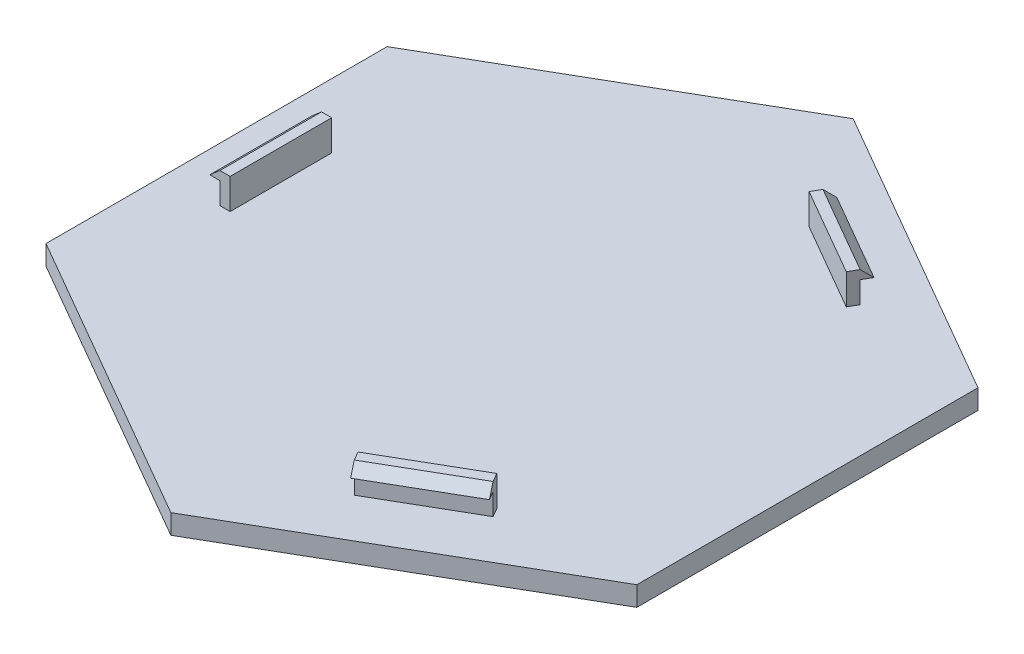
ISO-10303-21;
HEADER;
FILE_DESCRIPTION(('STEP AP214'),'2;1');
FILE_NAME('part.step','',(''),(''),'','','');
FILE_SCHEMA(('AUTOMOTIVE_DESIGN { 1 0 10303 214 1 1 1 1 }'));
ENDSEC;
DATA;
#1=APPLICATION_CONTEXT('core data for automotive mechanical design processes');
#2=APPLICATION_PROTOCOL_DEFINITION('international standard','automotive_design',2000,#1);
#3=PRODUCT_CONTEXT('',#1,'mechanical');
#4=PRODUCT('Part','Part','',(#3));
#5=PRODUCT_RELATED_PRODUCT_CATEGORY('part','',(#4));
#6=PRODUCT_DEFINITION_FORMATION('','',#4);
#7=PRODUCT_DEFINITION_CONTEXT('part definition',#1,'design');
#8=PRODUCT_DEFINITION('design','',#6,#7);
#9=PRODUCT_DEFINITION_SHAPE('','',#8);
#10=(LENGTH_UNIT() NAMED_UNIT(*) SI_UNIT(.MILLI.,.METRE.));
#11=(NAMED_UNIT(*) PLANE_ANGLE_UNIT() SI_UNIT($,.RADIAN.));
#12=(NAMED_UNIT(*) SI_UNIT($,.STERADIAN.) SOLID_ANGLE_UNIT());
#13=UNCERTAINTY_MEASURE_WITH_UNIT(LENGTH_MEASURE(1.E-05),#10,'distance_accuracy_value','');
#14=(GEOMETRIC_REPRESENTATION_CONTEXT(3) GLOBAL_UNCERTAINTY_ASSIGNED_CONTEXT((#13)) GLOBAL_UNIT_ASSIGNED_CONTEXT((#10,
#11,#12)) REPRESENTATION_CONTEXT('',''));
#15=CARTESIAN_POINT('',(0.,0.,0.));
#16=DIRECTION('',(0.,0.,1.));
#17=DIRECTION('',(1.,0.,0.));
#18=AXIS2_PLACEMENT_3D('',#15,#16,#17);
#19=CARTESIAN_POINT('',(24.3051905283835,7.4,-27.0978248828015));
#20=DIRECTION('',(-0.5,0.,0.866025403784439));
#21=DIRECTION('',(0.866025403784439,0.,0.5));
#22=AXIS2_PLACEMENT_3D('',#19,#20,#21);
#23=PLANE('',#22);
#24=DIRECTION('',(-0.866025403784439,0.,-0.5));
#25=VECTOR('',#24,1.);
#26=CARTESIAN_POINT('',(17.81,6.1,-30.8478248828017));
#27=LINE('',#26,#25);
#28=CARTESIAN_POINT('',(24.3051905283835,6.1,-27.0978248828015));
#29=VERTEX_POINT('',#28);
#30=CARTESIAN_POINT('',(11.3148094716169,6.1,-34.5978248828016));
#31=VERTEX_POINT('',#30);
#32=EDGE_CURVE('E456',#29,#31,#27,.T.);
#33=ORIENTED_EDGE('',*,*,#32,.F.);
#34=DIRECTION('',(0.,-1.,0.));
#35=VECTOR('',#34,1.);
#36=CARTESIAN_POINT('',(24.3051905283835,7.4,-27.0978248828015));
#37=LINE('',#36,#35);
#38=CARTESIAN_POINT('',(24.3051905283835,2.9,-27.0978248828015));
#39=VERTEX_POINT('',#38);
#40=EDGE_CURVE('E238',#29,#39,#37,.T.);
#41=ORIENTED_EDGE('',*,*,#40,.T.);
#42=DIRECTION('',(-0.866025403784439,0.,-0.5));
#43=VECTOR('',#42,1.);
#44=CARTESIAN_POINT('',(24.3051905283835,2.9,-27.0978248828015));
#45=LINE('',#44,#43);
#46=CARTESIAN_POINT('',(11.3148094716169,2.9,-34.5978248828015));
#47=VERTEX_POINT('',#46);
#48=EDGE_CURVE('E261',#39,#47,#45,.T.);
#49=ORIENTED_EDGE('',*,*,#48,.T.);
#50=DIRECTION('',(0.,-1.,0.));
#51=VECTOR('',#50,1.);
#52=CARTESIAN_POINT('',(11.3148094716169,7.4,-34.5978248828015));
#53=LINE('',#52,#51);
#54=EDGE_CURVE('E244',#31,#47,#53,.T.);
#55=ORIENTED_EDGE('',*,*,#54,.F.);
#56=EDGE_LOOP('',(#33,#41,#49,#55));
#57=FACE_BOUND('',#56,.T.);
#58=ADVANCED_FACE('F45',(#57),#23,.F.);
#59=CARTESIAN_POINT('',(11.3148094716168,7.4,34.5978248828016));
#60=DIRECTION('',(-0.5,0.,-0.866025403784439));
#61=DIRECTION('',(-0.866025403784439,0.,0.5));
#62=AXIS2_PLACEMENT_3D('',#59,#60,#61);
#63=PLANE('',#62);
#64=DIRECTION('',(0.866025403784439,0.,-0.5));
#65=VECTOR('',#64,1.);
#66=CARTESIAN_POINT('',(17.81,6.1,30.8478248828017));
#67=LINE('',#66,#65);
#68=CARTESIAN_POINT('',(11.3148094716168,6.1,34.5978248828016));
#69=VERTEX_POINT('',#68);
#70=CARTESIAN_POINT('',(24.3051905283834,6.1,27.0978248828016));
#71=VERTEX_POINT('',#70);
#72=EDGE_CURVE('E484',#69,#71,#67,.T.);
#73=ORIENTED_EDGE('',*,*,#72,.F.);
#74=DIRECTION('',(0.,-1.,0.));
#75=VECTOR('',#74,1.);
#76=CARTESIAN_POINT('',(11.3148094716168,7.4,34.5978248828016));
#77=LINE('',#76,#75);
#78=CARTESIAN_POINT('',(11.3148094716168,2.9,34.5978248828016));
#79=VERTEX_POINT('',#78);
#80=EDGE_CURVE('E269',#69,#79,#77,.T.);
#81=ORIENTED_EDGE('',*,*,#80,.T.);
#82=DIRECTION('',(0.866025403784439,0.,-0.5));
#83=VECTOR('',#82,1.);
#84=CARTESIAN_POINT('',(11.3148094716168,2.9,34.5978248828016));
#85=LINE('',#84,#83);
#86=CARTESIAN_POINT('',(24.3051905283834,2.9,27.0978248828016));
#87=VERTEX_POINT('',#86);
#88=EDGE_CURVE('E297',#79,#87,#85,.T.);
#89=ORIENTED_EDGE('',*,*,#88,.T.);
#90=DIRECTION('',(0.,-1.,0.));
#91=VECTOR('',#90,1.);
#92=CARTESIAN_POINT('',(24.3051905283834,7.4,27.0978248828016));
#93=LINE('',#92,#91);
#94=EDGE_CURVE('E280',#71,#87,#93,.T.);
#95=ORIENTED_EDGE('',*,*,#94,.F.);
#96=EDGE_LOOP('',(#73,#81,#89,#95));
#97=FACE_BOUND('',#96,.T.);
#98=ADVANCED_FACE('F512',(#97),#63,.F.);
#99=CARTESIAN_POINT('',(-35.6199999999999,7.4,-7.5));
#100=DIRECTION('',(1.,0.,0.));
#101=DIRECTION('',(0.,0.,-1.));
#102=AXIS2_PLACEMENT_3D('',#99,#100,#101);
#103=PLANE('',#102);
#104=DIRECTION('',(0.,0.,1.));
#105=VECTOR('',#104,1.);
#106=CARTESIAN_POINT('',(-35.6199999999999,6.1,0.));
#107=LINE('',#106,#105);
#108=CARTESIAN_POINT('',(-35.6199999999999,6.1,-7.5));
#109=VERTEX_POINT('',#108);
#110=CARTESIAN_POINT('',(-35.6199999999999,6.1,7.5));
#111=VERTEX_POINT('',#110);
#112=EDGE_CURVE('E220',#109,#111,#107,.T.);
#113=ORIENTED_EDGE('',*,*,#112,.F.);
#114=DIRECTION('',(0.,-1.,0.));
#115=VECTOR('',#114,1.);
#116=CARTESIAN_POINT('',(-35.6199999999999,7.4,-7.5));
#117=LINE('',#116,#115);
#118=CARTESIAN_POINT('',(-35.6199999999999,2.9,-7.5));
#119=VERTEX_POINT('',#118);
#120=EDGE_CURVE('E347',#109,#119,#117,.T.);
#121=ORIENTED_EDGE('',*,*,#120,.T.);
#122=DIRECTION('',(0.,0.,1.));
#123=VECTOR('',#122,1.);
#124=CARTESIAN_POINT('',(-35.6199999999999,2.9,-7.5));
#125=LINE('',#124,#123);
#126=CARTESIAN_POINT('',(-35.6199999999999,2.9,7.5));
#127=VERTEX_POINT('',#126);
#128=EDGE_CURVE('E328',#119,#127,#125,.T.);
#129=ORIENTED_EDGE('',*,*,#128,.T.);
#130=DIRECTION('',(0.,-1.,0.));
#131=VECTOR('',#130,1.);
#132=CARTESIAN_POINT('',(-35.6199999999999,7.4,7.5));
#133=LINE('',#132,#131);
#134=EDGE_CURVE('E344',#111,#127,#133,.T.);
#135=ORIENTED_EDGE('',*,*,#134,.F.);
#136=EDGE_LOOP('',(#113,#121,#129,#135));
#137=FACE_BOUND('',#136,.T.);
#138=ADVANCED_FACE('F438',(#137),#103,.F.);
#139=CARTESIAN_POINT('',(0.,2.9,0.));
#140=DIRECTION('',(0.,1.,0.));
#141=DIRECTION('',(0.,0.,1.));
#142=AXIS2_PLACEMENT_3D('',#139,#140,#141);
#143=PLANE('',#142);
#144=DIRECTION('',(-0.866025403784438,0.,0.5));
#145=VECTOR('',#144,1.);
#146=CARTESIAN_POINT('',(-12.2247627531244,2.9,-43.3100674178072));
#147=LINE('',#146,#145);
#148=CARTESIAN_POINT('',(0.,2.9,-50.3680374841029));
#149=VERTEX_POINT('',#148);
#150=CARTESIAN_POINT('',(-43.62,2.9,-25.1840187420514));
#151=VERTEX_POINT('',#150);
#152=EDGE_CURVE('E351',#149,#151,#147,.T.);
#153=ORIENTED_EDGE('',*,*,#152,.T.);
#154=DIRECTION('',(0.,0.,1.));
#155=VECTOR('',#154,1.);
#156=CARTESIAN_POINT('',(-43.62,2.9,-11.06807860946));
#157=LINE('',#156,#155);
#158=CARTESIAN_POINT('',(-43.62,2.9,25.1840187420515));
#159=VERTEX_POINT('',#158);
#160=EDGE_CURVE('E354',#151,#159,#157,.T.);
#161=ORIENTED_EDGE('',*,*,#160,.T.);
#162=DIRECTION('',(0.866025403784439,0.,0.5));
#163=VECTOR('',#162,1.);
#164=CARTESIAN_POINT('',(-31.3952372468755,2.9,32.2419888083473));
#165=LINE('',#164,#163);
#166=CARTESIAN_POINT('',(0.,2.9,50.368037484103));
#167=VERTEX_POINT('',#166);
#168=EDGE_CURVE('E358',#159,#167,#165,.T.);
#169=ORIENTED_EDGE('',*,*,#168,.T.);
#170=DIRECTION('',(0.866025403784439,0.,-0.5));
#171=VECTOR('',#170,1.);
#172=CARTESIAN_POINT('',(12.2247627531247,2.9,43.3100674178072));
#173=LINE('',#172,#171);
#174=CARTESIAN_POINT('',(43.6199999999999,2.9,25.1840187420516));
#175=VERTEX_POINT('',#174);
#176=EDGE_CURVE('E361',#167,#175,#173,.T.);
#177=ORIENTED_EDGE('',*,*,#176,.T.);
#178=DIRECTION('',(0.,0.,-1.));
#179=VECTOR('',#178,1.);
#180=CARTESIAN_POINT('',(43.6199999999999,2.9,11.0680786094603));
#181=LINE('',#180,#179);
#182=CARTESIAN_POINT('',(43.6199999999999,2.9,-25.1840187420514));
#183=VERTEX_POINT('',#182);
#184=EDGE_CURVE('E364',#175,#183,#181,.T.);
#185=ORIENTED_EDGE('',*,*,#184,.T.);
#186=DIRECTION('',(-0.866025403784439,0.,-0.5));
#187=VECTOR('',#186,1.);
#188=CARTESIAN_POINT('',(31.3952372468757,2.9,-32.241988808347));
#189=LINE('',#188,#187);
#190=EDGE_CURVE('E367',#183,#149,#189,.T.);
#191=ORIENTED_EDGE('',*,*,#190,.T.);
#192=EDGE_LOOP('',(#153,#161,#169,#177,#185,#191));
#193=FACE_BOUND('',#192,.T.);
#194=ORIENTED_EDGE('',*,*,#128,.F.);
#195=DIRECTION('',(-1.,0.,0.));
#196=VECTOR('',#195,1.);
#197=CARTESIAN_POINT('',(-35.6199999999999,2.9,-7.5));
#198=LINE('',#197,#196);
#199=CARTESIAN_POINT('',(-34.1199999999999,2.9,-7.5));
#200=VERTEX_POINT('',#199);
#201=EDGE_CURVE('E305',#200,#119,#198,.T.);
#202=ORIENTED_EDGE('',*,*,#201,.F.);
#203=DIRECTION('',(0.,0.,-1.));
#204=VECTOR('',#203,1.);
#205=CARTESIAN_POINT('',(-34.1199999999999,2.9,0.));
#206=LINE('',#205,#204);
#207=CARTESIAN_POINT('',(-34.1199999999999,2.9,7.5));
#208=VERTEX_POINT('',#207);
#209=EDGE_CURVE('E318',#208,#200,#206,.T.);
#210=ORIENTED_EDGE('',*,*,#209,.F.);
#211=DIRECTION('',(1.,0.,0.));
#212=VECTOR('',#211,1.);
#213=CARTESIAN_POINT('',(-34.1199999999999,2.9,7.5));
#214=LINE('',#213,#212);
#215=EDGE_CURVE('E332',#127,#208,#214,.T.);
#216=ORIENTED_EDGE('',*,*,#215,.F.);
#217=EDGE_LOOP('',(#194,#202,#210,#216));
#218=FACE_BOUND('',#217,.T.);
#219=ORIENTED_EDGE('',*,*,#88,.F.);
#220=DIRECTION('',(0.500000000000006,0.,0.866025403784435));
#221=VECTOR('',#220,1.);
#222=CARTESIAN_POINT('',(11.3148094716168,2.9,34.5978248828016));
#223=LINE('',#222,#221);
#224=CARTESIAN_POINT('',(10.5648094716168,2.9,33.2987867771249));
#225=VERTEX_POINT('',#224);
#226=EDGE_CURVE('E301',#225,#79,#223,.T.);
#227=ORIENTED_EDGE('',*,*,#226,.F.);
#228=DIRECTION('',(-0.866025403784439,0.,0.499999999999999));
#229=VECTOR('',#228,1.);
#230=CARTESIAN_POINT('',(17.0600000000001,2.9,29.5487867771249));
#231=LINE('',#230,#229);
#232=CARTESIAN_POINT('',(23.5551905283834,2.9,25.7987867771249));
#233=VERTEX_POINT('',#232);
#234=EDGE_CURVE('E290',#233,#225,#231,.T.);
#235=ORIENTED_EDGE('',*,*,#234,.F.);
#236=DIRECTION('',(-0.499999999999993,0.,-0.866025403784443));
#237=VECTOR('',#236,1.);
#238=CARTESIAN_POINT('',(23.5551905283834,2.9,25.7987867771249));
#239=LINE('',#238,#237);
#240=EDGE_CURVE('E293',#87,#233,#239,.T.);
#241=ORIENTED_EDGE('',*,*,#240,.F.);
#242=EDGE_LOOP('',(#219,#227,#235,#241));
#243=FACE_BOUND('',#242,.T.);
#244=ORIENTED_EDGE('',*,*,#48,.F.);
#245=DIRECTION('',(0.500000000000006,0.,-0.866025403784435));
#246=VECTOR('',#245,1.);
#247=CARTESIAN_POINT('',(24.3051905283835,2.9,-27.0978248828015));
#248=LINE('',#247,#246);
#249=CARTESIAN_POINT('',(23.5551905283835,2.9,-25.7987867771249));
#250=VERTEX_POINT('',#249);
#251=EDGE_CURVE('E265',#250,#39,#248,.T.);
#252=ORIENTED_EDGE('',*,*,#251,.F.);
#253=DIRECTION('',(0.866025403784438,0.,0.500000000000001));
#254=VECTOR('',#253,1.);
#255=CARTESIAN_POINT('',(17.0600000000002,2.9,-29.5487867771249));
#256=LINE('',#255,#254);
#257=CARTESIAN_POINT('',(10.5648094716169,2.9,-33.2987867771249));
#258=VERTEX_POINT('',#257);
#259=EDGE_CURVE('E254',#258,#250,#256,.T.);
#260=ORIENTED_EDGE('',*,*,#259,.F.);
#261=DIRECTION('',(-0.499999999999991,0.,0.866025403784444));
#262=VECTOR('',#261,1.);
#263=CARTESIAN_POINT('',(10.5648094716169,2.9,-33.2987867771249));
#264=LINE('',#263,#262);
#265=EDGE_CURVE('E257',#47,#258,#264,.T.);
#266=ORIENTED_EDGE('',*,*,#265,.F.);
#267=EDGE_LOOP('',(#244,#252,#260,#266));
#268=FACE_BOUND('',#267,.T.);
#269=ADVANCED_FACE('F435',(#193,#218,#243,#268),#143,.T.);
#270=CARTESIAN_POINT('',(-12.2247627531244,2.9,-43.3100674178072));
#271=DIRECTION('',(0.5,0.,0.866025403784439));
#272=DIRECTION('',(0.866025403784439,0.,-0.5));
#273=AXIS2_PLACEMENT_3D('',#270,#271,#272);
#274=PLANE('',#273);
#275=DIRECTION('',(-0.866025403784439,0.,0.5));
#276=VECTOR('',#275,1.);
#277=CARTESIAN_POINT('',(-12.2247627531244,0.,-43.3100674178072));
#278=LINE('',#277,#276);
#279=CARTESIAN_POINT('',(0.,0.,-50.3680374841029));
#280=VERTEX_POINT('',#279);
#281=CARTESIAN_POINT('',(-43.62,0.,-25.1840187420514));
#282=VERTEX_POINT('',#281);
#283=EDGE_CURVE('E350',#280,#282,#278,.T.);
#284=ORIENTED_EDGE('',*,*,#283,.T.);
#285=DIRECTION('',(0.,-1.,0.));
#286=VECTOR('',#285,1.);
#287=CARTESIAN_POINT('',(-43.62,2.9,-25.1840187420514));
#288=LINE('',#287,#286);
#289=EDGE_CURVE('E11',#151,#282,#288,.T.);
#290=ORIENTED_EDGE('',*,*,#289,.F.);
#291=ORIENTED_EDGE('',*,*,#152,.F.);
#292=DIRECTION('',(0.,-1.,0.));
#293=VECTOR('',#292,1.);
#294=CARTESIAN_POINT('',(0.,2.9,-50.3680374841029));
#295=LINE('',#294,#293);
#296=EDGE_CURVE('E370',#149,#280,#295,.T.);
#297=ORIENTED_EDGE('',*,*,#296,.T.);
#298=EDGE_LOOP('',(#284,#290,#291,#297));
#299=FACE_BOUND('',#298,.T.);
#300=ADVANCED_FACE('F47',(#299),#274,.F.);
#301=CARTESIAN_POINT('',(-43.62,2.9,-11.06807860946));
#302=DIRECTION('',(1.,0.,0.));
#303=DIRECTION('',(0.,0.,-1.));
#304=AXIS2_PLACEMENT_3D('',#301,#302,#303);
#305=PLANE('',#304);
#306=DIRECTION('',(0.,0.,1.));
#307=VECTOR('',#306,1.);
#308=CARTESIAN_POINT('',(-43.62,0.,-11.06807860946));
#309=LINE('',#308,#307);
#310=CARTESIAN_POINT('',(-43.62,0.,25.1840187420515));
#311=VERTEX_POINT('',#310);
#312=EDGE_CURVE('E374',#282,#311,#309,.T.);
#313=ORIENTED_EDGE('',*,*,#312,.T.);
#314=DIRECTION('',(0.,-1.,0.));
#315=VECTOR('',#314,1.);
#316=CARTESIAN_POINT('',(-43.62,2.9,25.1840187420515));
#317=LINE('',#316,#315);
#318=EDGE_CURVE('E54',#159,#311,#317,.T.);
#319=ORIENTED_EDGE('',*,*,#318,.F.);
#320=ORIENTED_EDGE('',*,*,#160,.F.);
#321=ORIENTED_EDGE('',*,*,#289,.T.);
#322=EDGE_LOOP('',(#313,#319,#320,#321));
#323=FACE_BOUND('',#322,.T.);
#324=ADVANCED_FACE('F416',(#323),#305,.F.);
#325=CARTESIAN_POINT('',(-31.3952372468755,2.9,32.2419888083473));
#326=DIRECTION('',(0.5,0.,-0.866025403784439));
#327=DIRECTION('',(-0.866025403784439,0.,-0.5));
#328=AXIS2_PLACEMENT_3D('',#325,#326,#327);
#329=PLANE('',#328);
#330=DIRECTION('',(0.866025403784439,0.,0.5));
#331=VECTOR('',#330,1.);
#332=CARTESIAN_POINT('',(-31.3952372468755,0.,32.2419888083473));
#333=LINE('',#332,#331);
#334=CARTESIAN_POINT('',(0.,0.,50.368037484103));
#335=VERTEX_POINT('',#334);
#336=EDGE_CURVE('E378',#311,#335,#333,.T.);
#337=ORIENTED_EDGE('',*,*,#336,.T.);
#338=DIRECTION('',(0.,-1.,0.));
#339=VECTOR('',#338,1.);
#340=CARTESIAN_POINT('',(0.,2.9,50.368037484103));
#341=LINE('',#340,#339);
#342=EDGE_CURVE('E404',#167,#335,#341,.T.);
#343=ORIENTED_EDGE('',*,*,#342,.F.);
#344=ORIENTED_EDGE('',*,*,#168,.F.);
#345=ORIENTED_EDGE('',*,*,#318,.T.);
#346=EDGE_LOOP('',(#337,#343,#344,#345));
#347=FACE_BOUND('',#346,.T.);
#348=ADVANCED_FACE('F412',(#347),#329,.F.);
#349=CARTESIAN_POINT('',(12.2247627531247,2.9,43.3100674178072));
#350=DIRECTION('',(-0.5,0.,-0.866025403784439));
#351=DIRECTION('',(-0.866025403784439,0.,0.5));
#352=AXIS2_PLACEMENT_3D('',#349,#350,#351);
#353=PLANE('',#352);
#354=DIRECTION('',(0.866025403784439,0.,-0.5));
#355=VECTOR('',#354,1.);
#356=CARTESIAN_POINT('',(12.2247627531247,0.,43.3100674178072));
#357=LINE('',#356,#355);
#358=CARTESIAN_POINT('',(43.6199999999999,0.,25.1840187420516));
#359=VERTEX_POINT('',#358);
#360=EDGE_CURVE('E382',#335,#359,#357,.T.);
#361=ORIENTED_EDGE('',*,*,#360,.T.);
#362=DIRECTION('',(0.,-1.,0.));
#363=VECTOR('',#362,1.);
#364=CARTESIAN_POINT('',(43.6199999999999,2.9,25.1840187420516));
#365=LINE('',#364,#363);
#366=EDGE_CURVE('E400',#175,#359,#365,.T.);
#367=ORIENTED_EDGE('',*,*,#366,.F.);
#368=ORIENTED_EDGE('',*,*,#176,.F.);
#369=ORIENTED_EDGE('',*,*,#342,.T.);
#370=EDGE_LOOP('',(#361,#367,#368,#369));
#371=FACE_BOUND('',#370,.T.);
#372=ADVANCED_FACE('F433',(#371),#353,.F.);
#373=CARTESIAN_POINT('',(43.6199999999999,2.9,11.0680786094603));
#374=DIRECTION('',(-1.,0.,0.));
#375=DIRECTION('',(0.,0.,1.));
#376=AXIS2_PLACEMENT_3D('',#373,#374,#375);
#377=PLANE('',#376);
#378=DIRECTION('',(0.,0.,-1.));
#379=VECTOR('',#378,1.);
#380=CARTESIAN_POINT('',(43.6199999999999,0.,11.0680786094603));
#381=LINE('',#380,#379);
#382=CARTESIAN_POINT('',(43.6199999999999,0.,-25.1840187420514));
#383=VERTEX_POINT('',#382);
#384=EDGE_CURVE('E386',#359,#383,#381,.T.);
#385=ORIENTED_EDGE('',*,*,#384,.T.);
#386=DIRECTION('',(0.,-1.,0.));
#387=VECTOR('',#386,1.);
#388=CARTESIAN_POINT('',(43.6199999999999,2.9,-25.1840187420514));
#389=LINE('',#388,#387);
#390=EDGE_CURVE('E396',#183,#383,#389,.T.);
#391=ORIENTED_EDGE('',*,*,#390,.F.);
#392=ORIENTED_EDGE('',*,*,#184,.F.);
#393=ORIENTED_EDGE('',*,*,#366,.T.);
#394=EDGE_LOOP('',(#385,#391,#392,#393));
#395=FACE_BOUND('',#394,.T.);
#396=ADVANCED_FACE('F428',(#395),#377,.F.);
#397=CARTESIAN_POINT('',(31.3952372468757,2.9,-32.241988808347));
#398=DIRECTION('',(-0.5,0.,0.866025403784439));
#399=DIRECTION('',(0.866025403784439,0.,0.5));
#400=AXIS2_PLACEMENT_3D('',#397,#398,#399);
#401=PLANE('',#400);
#402=DIRECTION('',(-0.866025403784439,0.,-0.5));
#403=VECTOR('',#402,1.);
#404=CARTESIAN_POINT('',(31.3952372468757,0.,-32.241988808347));
#405=LINE('',#404,#403);
#406=EDGE_CURVE('E355',#383,#280,#405,.T.);
#407=ORIENTED_EDGE('',*,*,#406,.T.);
#408=ORIENTED_EDGE('',*,*,#296,.F.);
#409=ORIENTED_EDGE('',*,*,#190,.F.);
#410=ORIENTED_EDGE('',*,*,#390,.T.);
#411=EDGE_LOOP('',(#407,#408,#409,#410));
#412=FACE_BOUND('',#411,.T.);
#413=ADVANCED_FACE('F425',(#412),#401,.F.);
#414=CARTESIAN_POINT('',(0.,0.,0.));
#415=DIRECTION('',(0.,1.,0.));
#416=DIRECTION('',(0.,0.,1.));
#417=AXIS2_PLACEMENT_3D('',#414,#415,#416);
#418=PLANE('',#417);
#419=ORIENTED_EDGE('',*,*,#283,.F.);
#420=ORIENTED_EDGE('',*,*,#406,.F.);
#421=ORIENTED_EDGE('',*,*,#384,.F.);
#422=ORIENTED_EDGE('',*,*,#360,.F.);
#423=ORIENTED_EDGE('',*,*,#336,.F.);
#424=ORIENTED_EDGE('',*,*,#312,.F.);
#425=EDGE_LOOP('',(#419,#420,#421,#422,#423,#424));
#426=FACE_BOUND('',#425,.T.);
#427=ADVANCED_FACE('F419',(#426),#418,.F.);
#428=CARTESIAN_POINT('',(-35.6199999999999,7.4,-7.5));
#429=DIRECTION('',(0.,0.,1.));
#430=DIRECTION('',(1.,0.,0.));
#431=AXIS2_PLACEMENT_3D('',#428,#429,#430);
#432=PLANE('',#431);
#433=DIRECTION('',(1.,0.,0.));
#434=VECTOR('',#433,1.);
#435=CARTESIAN_POINT('',(-37.12,6.1,-7.5));
#436=LINE('',#435,#434);
#437=CARTESIAN_POINT('',(-37.12,6.1,-7.5));
#438=VERTEX_POINT('',#437);
#439=EDGE_CURVE('E235',#438,#109,#436,.T.);
#440=ORIENTED_EDGE('',*,*,#439,.F.);
#441=DIRECTION('',(0.755689082789819,0.65493053841784,0.));
#442=VECTOR('',#441,1.);
#443=CARTESIAN_POINT('',(-35.6199999999999,7.39999999999999,-7.5));
#444=LINE('',#443,#442);
#445=CARTESIAN_POINT('',(-35.6199999999999,7.4,-7.5));
#446=VERTEX_POINT('',#445);
#447=EDGE_CURVE('E214',#438,#446,#444,.T.);
#448=ORIENTED_EDGE('',*,*,#447,.T.);
#449=DIRECTION('',(-1.,0.,0.));
#450=VECTOR('',#449,1.);
#451=CARTESIAN_POINT('',(-35.6199999999999,7.4,-7.5));
#452=LINE('',#451,#450);
#453=CARTESIAN_POINT('',(-34.1199999999999,7.4,-7.5));
#454=VERTEX_POINT('',#453);
#455=EDGE_CURVE('E314',#454,#446,#452,.T.);
#456=ORIENTED_EDGE('',*,*,#455,.F.);
#457=DIRECTION('',(0.,-1.,0.));
#458=VECTOR('',#457,1.);
#459=CARTESIAN_POINT('',(-34.1199999999999,7.4,-7.5));
#460=LINE('',#459,#458);
#461=EDGE_CURVE('E324',#454,#200,#460,.T.);
#462=ORIENTED_EDGE('',*,*,#461,.T.);
#463=ORIENTED_EDGE('',*,*,#201,.T.);
#464=ORIENTED_EDGE('',*,*,#120,.F.);
#465=EDGE_LOOP('',(#440,#448,#456,#462,#463,#464));
#466=FACE_BOUND('',#465,.T.);
#467=ADVANCED_FACE('F551',(#466),#432,.F.);
#468=CARTESIAN_POINT('',(-34.1199999999999,7.4,7.5));
#469=DIRECTION('',(0.,0.,-1.));
#470=DIRECTION('',(-1.,0.,0.));
#471=AXIS2_PLACEMENT_3D('',#468,#469,#470);
#472=PLANE('',#471);
#473=DIRECTION('',(1.,0.,0.));
#474=VECTOR('',#473,1.);
#475=CARTESIAN_POINT('',(-34.1199999999999,7.4,7.5));
#476=LINE('',#475,#474);
#477=CARTESIAN_POINT('',(-35.6199999999999,7.4,7.5));
#478=VERTEX_POINT('',#477);
#479=CARTESIAN_POINT('',(-34.1199999999999,7.4,7.5));
#480=VERTEX_POINT('',#479);
#481=EDGE_CURVE('E228',#478,#480,#476,.T.);
#482=ORIENTED_EDGE('',*,*,#481,.F.);
#483=DIRECTION('',(0.755689082789819,0.65493053841784,0.));
#484=VECTOR('',#483,1.);
#485=CARTESIAN_POINT('',(-37.1199999999999,6.1,7.5));
#486=LINE('',#485,#484);
#487=CARTESIAN_POINT('',(-37.1199999999999,6.1,7.5));
#488=VERTEX_POINT('',#487);
#489=EDGE_CURVE('E211',#488,#478,#486,.T.);
#490=ORIENTED_EDGE('',*,*,#489,.F.);
#491=DIRECTION('',(1.,0.,0.));
#492=VECTOR('',#491,1.);
#493=CARTESIAN_POINT('',(-37.1199999999999,6.1,7.5));
#494=LINE('',#493,#492);
#495=EDGE_CURVE('E219',#488,#111,#494,.T.);
#496=ORIENTED_EDGE('',*,*,#495,.T.);
#497=ORIENTED_EDGE('',*,*,#134,.T.);
#498=ORIENTED_EDGE('',*,*,#215,.T.);
#499=DIRECTION('',(0.,-1.,0.));
#500=VECTOR('',#499,1.);
#501=CARTESIAN_POINT('',(-34.1199999999999,7.4,7.5));
#502=LINE('',#501,#500);
#503=EDGE_CURVE('E341',#480,#208,#502,.T.);
#504=ORIENTED_EDGE('',*,*,#503,.F.);
#505=EDGE_LOOP('',(#482,#490,#496,#497,#498,#504));
#506=FACE_BOUND('',#505,.T.);
#507=ADVANCED_FACE('F225',(#506),#472,.F.);
#508=CARTESIAN_POINT('',(-34.1199999999999,7.4,0.));
#509=DIRECTION('',(-1.,0.,0.));
#510=DIRECTION('',(0.,0.,1.));
#511=AXIS2_PLACEMENT_3D('',#508,#509,#510);
#512=PLANE('',#511);
#513=ORIENTED_EDGE('',*,*,#209,.T.);
#514=ORIENTED_EDGE('',*,*,#461,.F.);
#515=DIRECTION('',(0.,0.,-1.));
#516=VECTOR('',#515,1.);
#517=CARTESIAN_POINT('',(-34.1199999999999,7.4,0.));
#518=LINE('',#517,#516);
#519=EDGE_CURVE('E321',#480,#454,#518,.T.);
#520=ORIENTED_EDGE('',*,*,#519,.F.);
#521=ORIENTED_EDGE('',*,*,#503,.T.);
#522=EDGE_LOOP('',(#513,#514,#520,#521));
#523=FACE_BOUND('',#522,.T.);
#524=ADVANCED_FACE('F558',(#523),#512,.F.);
#525=CARTESIAN_POINT('',(0.,7.4,0.));
#526=DIRECTION('',(0.,1.,0.));
#527=DIRECTION('',(0.,0.,1.));
#528=AXIS2_PLACEMENT_3D('',#525,#526,#527);
#529=PLANE('',#528);
#530=DIRECTION('',(0.,0.,1.));
#531=VECTOR('',#530,1.);
#532=CARTESIAN_POINT('',(-35.6199999999999,7.4,-50.3680374841029));
#533=LINE('',#532,#531);
#534=EDGE_CURVE('E230',#446,#478,#533,.T.);
#535=ORIENTED_EDGE('',*,*,#534,.T.);
#536=ORIENTED_EDGE('',*,*,#481,.T.);
#537=ORIENTED_EDGE('',*,*,#519,.T.);
#538=ORIENTED_EDGE('',*,*,#455,.T.);
#539=EDGE_LOOP('',(#535,#536,#537,#538));
#540=FACE_BOUND('',#539,.T.);
#541=ADVANCED_FACE('F548',(#540),#529,.T.);
#542=CARTESIAN_POINT('',(11.3148094716168,7.4,34.5978248828016));
#543=DIRECTION('',(0.866025403784435,0.,-0.500000000000006));
#544=DIRECTION('',(-0.500000000000006,0.,-0.866025403784435));
#545=AXIS2_PLACEMENT_3D('',#542,#543,#544);
#546=PLANE('',#545);
#547=DIRECTION('',(-0.5,0.,-0.866025403784438));
#548=VECTOR('',#547,1.);
#549=CARTESIAN_POINT('',(12.0648094716168,6.1,35.8968629884783));
#550=LINE('',#549,#548);
#551=CARTESIAN_POINT('',(12.0648094716168,6.1,35.8968629884783));
#552=VERTEX_POINT('',#551);
#553=EDGE_CURVE('E498',#552,#69,#550,.T.);
#554=ORIENTED_EDGE('',*,*,#553,.F.);
#555=DIRECTION('',(0.377844541394915,-0.654930538417842,0.654445943058541));
#556=VECTOR('',#555,1.);
#557=CARTESIAN_POINT('',(11.3148094716168,7.4,34.5978248828016));
#558=LINE('',#557,#556);
#559=CARTESIAN_POINT('',(11.3148094716168,7.4,34.5978248828016));
#560=VERTEX_POINT('',#559);
#561=EDGE_CURVE('E518',#560,#552,#558,.T.);
#562=ORIENTED_EDGE('',*,*,#561,.F.);
#563=DIRECTION('',(0.500000000000006,0.,0.866025403784435));
#564=VECTOR('',#563,1.);
#565=CARTESIAN_POINT('',(11.3148094716168,7.4,34.5978248828016));
#566=LINE('',#565,#564);
#567=CARTESIAN_POINT('',(10.5648094716168,7.4,33.2987867771249));
#568=VERTEX_POINT('',#567);
#569=EDGE_CURVE('E294',#568,#560,#566,.T.);
#570=ORIENTED_EDGE('',*,*,#569,.F.);
#571=DIRECTION('',(0.,-1.,0.));
#572=VECTOR('',#571,1.);
#573=CARTESIAN_POINT('',(10.5648094716168,7.4,33.2987867771249));
#574=LINE('',#573,#572);
#575=EDGE_CURVE('E285',#568,#225,#574,.T.);
#576=ORIENTED_EDGE('',*,*,#575,.T.);
#577=ORIENTED_EDGE('',*,*,#226,.T.);
#578=ORIENTED_EDGE('',*,*,#80,.F.);
#579=EDGE_LOOP('',(#554,#562,#570,#576,#577,#578));
#580=FACE_BOUND('',#579,.T.);
#581=ADVANCED_FACE('F513',(#580),#546,.F.);
#582=CARTESIAN_POINT('',(23.5551905283834,7.4,25.7987867771249));
#583=DIRECTION('',(-0.866025403784443,0.,0.499999999999993));
#584=DIRECTION('',(0.499999999999993,0.,0.866025403784443));
#585=AXIS2_PLACEMENT_3D('',#582,#583,#584);
#586=PLANE('',#585);
#587=DIRECTION('',(-0.499999999999993,0.,-0.866025403784443));
#588=VECTOR('',#587,1.);
#589=CARTESIAN_POINT('',(23.5551905283834,7.4,25.7987867771249));
#590=LINE('',#589,#588);
#591=CARTESIAN_POINT('',(24.3051905283834,7.4,27.0978248828015));
#592=VERTEX_POINT('',#591);
#593=CARTESIAN_POINT('',(23.5551905283834,7.4,25.7987867771249));
#594=VERTEX_POINT('',#593);
#595=EDGE_CURVE('E308',#592,#594,#590,.T.);
#596=ORIENTED_EDGE('',*,*,#595,.F.);
#597=DIRECTION('',(0.377844541394903,-0.654930538417842,0.654445943058547));
#598=VECTOR('',#597,1.);
#599=CARTESIAN_POINT('',(23.8768910359976,8.14238578680199,26.3559884011334));
#600=LINE('',#599,#598);
#601=CARTESIAN_POINT('',(25.0551905283834,6.1,28.3968629884782));
#602=VERTEX_POINT('',#601);
#603=EDGE_CURVE('E527',#592,#602,#600,.T.);
#604=ORIENTED_EDGE('',*,*,#603,.T.);
#605=DIRECTION('',(-0.5,0.,-0.866025403784438));
#606=VECTOR('',#605,1.);
#607=CARTESIAN_POINT('',(25.0551905283834,6.1,28.3968629884783));
#608=LINE('',#607,#606);
#609=EDGE_CURVE('E492',#602,#71,#608,.T.);
#610=ORIENTED_EDGE('',*,*,#609,.T.);
#611=ORIENTED_EDGE('',*,*,#94,.T.);
#612=ORIENTED_EDGE('',*,*,#240,.T.);
#613=DIRECTION('',(0.,-1.,0.));
#614=VECTOR('',#613,1.);
#615=CARTESIAN_POINT('',(23.5551905283834,7.4,25.7987867771249));
#616=LINE('',#615,#614);
#617=EDGE_CURVE('E69',#594,#233,#616,.T.);
#618=ORIENTED_EDGE('',*,*,#617,.F.);
#619=EDGE_LOOP('',(#596,#604,#610,#611,#612,#618));
#620=FACE_BOUND('',#619,.T.);
#621=ADVANCED_FACE('F526',(#620),#586,.F.);
#622=CARTESIAN_POINT('',(17.0600000000001,7.4,29.5487867771249));
#623=DIRECTION('',(0.499999999999999,0.,0.866025403784439));
#624=DIRECTION('',(0.866025403784439,0.,-0.499999999999999));
#625=AXIS2_PLACEMENT_3D('',#622,#623,#624);
#626=PLANE('',#625);
#627=ORIENTED_EDGE('',*,*,#234,.T.);
#628=ORIENTED_EDGE('',*,*,#575,.F.);
#629=DIRECTION('',(-0.866025403784439,0.,0.499999999999999));
#630=VECTOR('',#629,1.);
#631=CARTESIAN_POINT('',(17.0600000000001,7.4,29.5487867771249));
#632=LINE('',#631,#630);
#633=EDGE_CURVE('E289',#594,#568,#632,.T.);
#634=ORIENTED_EDGE('',*,*,#633,.F.);
#635=ORIENTED_EDGE('',*,*,#617,.T.);
#636=EDGE_LOOP('',(#627,#628,#634,#635));
#637=FACE_BOUND('',#636,.T.);
#638=ADVANCED_FACE('F517',(#637),#626,.F.);
#639=CARTESIAN_POINT('',(0.,7.4,0.));
#640=DIRECTION('',(0.,1.,0.));
#641=DIRECTION('',(0.,0.,1.));
#642=AXIS2_PLACEMENT_3D('',#639,#640,#641);
#643=PLANE('',#642);
#644=DIRECTION('',(-0.866025403784435,0.,0.500000000000006));
#645=VECTOR('',#644,1.);
#646=CARTESIAN_POINT('',(72.335,7.4,-0.632198544763256));
#647=LINE('',#646,#645);
#648=EDGE_CURVE('E522',#592,#560,#647,.T.);
#649=ORIENTED_EDGE('',*,*,#648,.F.);
#650=ORIENTED_EDGE('',*,*,#595,.T.);
#651=ORIENTED_EDGE('',*,*,#633,.T.);
#652=ORIENTED_EDGE('',*,*,#569,.T.);
#653=EDGE_LOOP('',(#649,#650,#651,#652));
#654=FACE_BOUND('',#653,.T.);
#655=ADVANCED_FACE('F521',(#654),#643,.T.);
#656=CARTESIAN_POINT('',(24.3051905283835,7.4,-27.0978248828015));
#657=DIRECTION('',(-0.866025403784435,0.,-0.500000000000006));
#658=DIRECTION('',(-0.500000000000006,0.,0.866025403784436));
#659=AXIS2_PLACEMENT_3D('',#656,#657,#658);
#660=PLANE('',#659);
#661=DIRECTION('',(-0.5,0.,0.866025403784438));
#662=VECTOR('',#661,1.);
#663=CARTESIAN_POINT('',(25.0551905283835,6.1,-28.3968629884782));
#664=LINE('',#663,#662);
#665=CARTESIAN_POINT('',(25.0551905283835,6.1,-28.3968629884782));
#666=VERTEX_POINT('',#665);
#667=EDGE_CURVE('E479',#666,#29,#664,.T.);
#668=ORIENTED_EDGE('',*,*,#667,.F.);
#669=DIRECTION('',(0.377844541394914,-0.654930538417843,-0.65444594305854));
#670=VECTOR('',#669,1.);
#671=CARTESIAN_POINT('',(25.0551905283835,6.1,-28.3968629884782));
#672=LINE('',#671,#670);
#673=CARTESIAN_POINT('',(24.3051905283835,7.4,-27.0978248828015));
#674=VERTEX_POINT('',#673);
#675=EDGE_CURVE('E541',#674,#666,#672,.T.);
#676=ORIENTED_EDGE('',*,*,#675,.F.);
#677=DIRECTION('',(0.500000000000006,0.,-0.866025403784435));
#678=VECTOR('',#677,1.);
#679=CARTESIAN_POINT('',(24.3051905283835,7.4,-27.0978248828015));
#680=LINE('',#679,#678);
#681=CARTESIAN_POINT('',(23.5551905283835,7.4,-25.7987867771249));
#682=VERTEX_POINT('',#681);
#683=EDGE_CURVE('E258',#682,#674,#680,.T.);
#684=ORIENTED_EDGE('',*,*,#683,.F.);
#685=DIRECTION('',(0.,-1.,0.));
#686=VECTOR('',#685,1.);
#687=CARTESIAN_POINT('',(23.5551905283835,7.4,-25.7987867771249));
#688=LINE('',#687,#686);
#689=EDGE_CURVE('E249',#682,#250,#688,.T.);
#690=ORIENTED_EDGE('',*,*,#689,.T.);
#691=ORIENTED_EDGE('',*,*,#251,.T.);
#692=ORIENTED_EDGE('',*,*,#40,.F.);
#693=EDGE_LOOP('',(#668,#676,#684,#690,#691,#692));
#694=FACE_BOUND('',#693,.T.);
#695=ADVANCED_FACE('F459',(#694),#660,.F.);
#696=CARTESIAN_POINT('',(10.5648094716169,7.4,-33.2987867771249));
#697=DIRECTION('',(0.866025403784444,0.,0.499999999999991));
#698=DIRECTION('',(0.499999999999991,0.,-0.866025403784444));
#699=AXIS2_PLACEMENT_3D('',#696,#697,#698);
#700=PLANE('',#699);
#701=DIRECTION('',(-0.499999999999991,0.,0.866025403784444));
#702=VECTOR('',#701,1.);
#703=CARTESIAN_POINT('',(10.5648094716169,7.4,-33.2987867771249));
#704=LINE('',#703,#702);
#705=CARTESIAN_POINT('',(11.3148094716169,7.4,-34.5978248828016));
#706=VERTEX_POINT('',#705);
#707=CARTESIAN_POINT('',(10.5648094716169,7.4,-33.2987867771249));
#708=VERTEX_POINT('',#707);
#709=EDGE_CURVE('E272',#706,#708,#704,.T.);
#710=ORIENTED_EDGE('',*,*,#709,.F.);
#711=DIRECTION('',(0.377844541394901,-0.654930538417843,-0.654445943058547));
#712=VECTOR('',#711,1.);
#713=CARTESIAN_POINT('',(10.8865099792311,8.14238578680208,-33.8559884011335));
#714=LINE('',#713,#712);
#715=CARTESIAN_POINT('',(12.0648094716169,6.1,-35.8968629884783));
#716=VERTEX_POINT('',#715);
#717=EDGE_CURVE('E475',#706,#716,#714,.T.);
#718=ORIENTED_EDGE('',*,*,#717,.T.);
#719=DIRECTION('',(-0.5,0.,0.866025403784438));
#720=VECTOR('',#719,1.);
#721=CARTESIAN_POINT('',(12.0648094716169,6.1,-35.8968629884782));
#722=LINE('',#721,#720);
#723=EDGE_CURVE('E474',#716,#31,#722,.T.);
#724=ORIENTED_EDGE('',*,*,#723,.T.);
#725=ORIENTED_EDGE('',*,*,#54,.T.);
#726=ORIENTED_EDGE('',*,*,#265,.T.);
#727=DIRECTION('',(0.,-1.,0.));
#728=VECTOR('',#727,1.);
#729=CARTESIAN_POINT('',(10.5648094716169,7.4,-33.2987867771249));
#730=LINE('',#729,#728);
#731=EDGE_CURVE('E61',#708,#258,#730,.T.);
#732=ORIENTED_EDGE('',*,*,#731,.F.);
#733=EDGE_LOOP('',(#710,#718,#724,#725,#726,#732));
#734=FACE_BOUND('',#733,.T.);
#735=ADVANCED_FACE('F471',(#734),#700,.F.);
#736=CARTESIAN_POINT('',(17.0600000000002,7.4,-29.5487867771249));
#737=DIRECTION('',(0.5,0.,-0.866025403784438));
#738=DIRECTION('',(-0.866025403784438,0.,-0.500000000000001));
#739=AXIS2_PLACEMENT_3D('',#736,#737,#738);
#740=PLANE('',#739);
#741=ORIENTED_EDGE('',*,*,#259,.T.);
#742=ORIENTED_EDGE('',*,*,#689,.F.);
#743=DIRECTION('',(0.866025403784438,0.,0.500000000000001));
#744=VECTOR('',#743,1.);
#745=CARTESIAN_POINT('',(17.0600000000002,7.4,-29.5487867771249));
#746=LINE('',#745,#744);
#747=EDGE_CURVE('E253',#708,#682,#746,.T.);
#748=ORIENTED_EDGE('',*,*,#747,.F.);
#749=ORIENTED_EDGE('',*,*,#731,.T.);
#750=EDGE_LOOP('',(#741,#742,#748,#749));
#751=FACE_BOUND('',#750,.T.);
#752=ADVANCED_FACE('F463',(#751),#740,.F.);
#753=CARTESIAN_POINT('',(0.,7.4,0.));
#754=DIRECTION('',(0.,1.,0.));
#755=DIRECTION('',(0.,0.,1.));
#756=AXIS2_PLACEMENT_3D('',#753,#754,#755);
#757=PLANE('',#756);
#758=DIRECTION('',(0.866025403784435,0.,0.500000000000006));
#759=VECTOR('',#758,1.);
#760=CARTESIAN_POINT('',(-36.7149999999997,7.4,-62.3278483103663));
#761=LINE('',#760,#759);
#762=EDGE_CURVE('E468',#706,#674,#761,.T.);
#763=ORIENTED_EDGE('',*,*,#762,.F.);
#764=ORIENTED_EDGE('',*,*,#709,.T.);
#765=ORIENTED_EDGE('',*,*,#747,.T.);
#766=ORIENTED_EDGE('',*,*,#683,.T.);
#767=EDGE_LOOP('',(#763,#764,#765,#766));
#768=FACE_BOUND('',#767,.T.);
#769=ADVANCED_FACE('F466',(#768),#757,.T.);
#770=CARTESIAN_POINT('',(-37.1199999999999,6.1,0.));
#771=DIRECTION('',(0.,1.,0.));
#772=DIRECTION('',(0.,0.,1.));
#773=AXIS2_PLACEMENT_3D('',#770,#771,#772);
#774=PLANE('',#773);
#775=ORIENTED_EDGE('',*,*,#112,.T.);
#776=ORIENTED_EDGE('',*,*,#495,.F.);
#777=DIRECTION('',(0.,0.,1.));
#778=VECTOR('',#777,1.);
#779=CARTESIAN_POINT('',(-37.1199999999999,6.1,0.));
#780=LINE('',#779,#778);
#781=EDGE_CURVE('E208',#438,#488,#780,.T.);
#782=ORIENTED_EDGE('',*,*,#781,.F.);
#783=ORIENTED_EDGE('',*,*,#439,.T.);
#784=EDGE_LOOP('',(#775,#776,#782,#783));
#785=FACE_BOUND('',#784,.T.);
#786=ADVANCED_FACE('F232',(#785),#774,.F.);
#787=CARTESIAN_POINT('',(18.56,6.1,32.1468629884783));
#788=DIRECTION('',(0.,1.,0.));
#789=DIRECTION('',(0.,0.,1.));
#790=AXIS2_PLACEMENT_3D('',#787,#788,#789);
#791=PLANE('',#790);
#792=ORIENTED_EDGE('',*,*,#72,.T.);
#793=ORIENTED_EDGE('',*,*,#609,.F.);
#794=DIRECTION('',(0.866025403784439,0.,-0.5));
#795=VECTOR('',#794,1.);
#796=CARTESIAN_POINT('',(18.56,6.1,32.1468629884783));
#797=LINE('',#796,#795);
#798=EDGE_CURVE('E489',#552,#602,#797,.T.);
#799=ORIENTED_EDGE('',*,*,#798,.F.);
#800=ORIENTED_EDGE('',*,*,#553,.T.);
#801=EDGE_LOOP('',(#792,#793,#799,#800));
#802=FACE_BOUND('',#801,.T.);
#803=ADVANCED_FACE('F505',(#802),#791,.F.);
#804=CARTESIAN_POINT('',(18.56,6.1,-32.1468629884783));
#805=DIRECTION('',(0.,1.,0.));
#806=DIRECTION('',(0.,0.,1.));
#807=AXIS2_PLACEMENT_3D('',#804,#805,#806);
#808=PLANE('',#807);
#809=ORIENTED_EDGE('',*,*,#32,.T.);
#810=ORIENTED_EDGE('',*,*,#723,.F.);
#811=DIRECTION('',(-0.866025403784439,0.,-0.5));
#812=VECTOR('',#811,1.);
#813=CARTESIAN_POINT('',(18.56,6.1,-32.1468629884783));
#814=LINE('',#813,#812);
#815=EDGE_CURVE('E480',#666,#716,#814,.T.);
#816=ORIENTED_EDGE('',*,*,#815,.F.);
#817=ORIENTED_EDGE('',*,*,#667,.T.);
#818=EDGE_LOOP('',(#809,#810,#816,#817));
#819=FACE_BOUND('',#818,.T.);
#820=ADVANCED_FACE('F623',(#819),#808,.F.);
#821=CARTESIAN_POINT('',(72.335,7.4,-0.632198544763256));
#822=DIRECTION('',(-0.327465269208925,-0.755689082789818,-0.567186483984069));
#823=DIRECTION('',(0.,0.600284225501492,-0.799786751962093));
#824=AXIS2_PLACEMENT_3D('',#821,#822,#823);
#825=PLANE('',#824);
#826=ORIENTED_EDGE('',*,*,#648,.T.);
#827=ORIENTED_EDGE('',*,*,#561,.T.);
#828=ORIENTED_EDGE('',*,*,#798,.T.);
#829=ORIENTED_EDGE('',*,*,#603,.F.);
#830=EDGE_LOOP('',(#826,#827,#828,#829));
#831=FACE_BOUND('',#830,.T.);
#832=ADVANCED_FACE('F629',(#831),#825,.F.);
#833=CARTESIAN_POINT('',(-35.9649999999997,6.1,-63.626886416043));
#834=DIRECTION('',(-0.327465269208925,-0.755689082789816,0.56718648398407));
#835=DIRECTION('',(0.,-0.600284225501493,-0.799786751962092));
#836=AXIS2_PLACEMENT_3D('',#833,#834,#835);
#837=PLANE('',#836);
#838=ORIENTED_EDGE('',*,*,#762,.T.);
#839=ORIENTED_EDGE('',*,*,#675,.T.);
#840=ORIENTED_EDGE('',*,*,#815,.T.);
#841=ORIENTED_EDGE('',*,*,#717,.F.);
#842=EDGE_LOOP('',(#838,#839,#840,#841));
#843=FACE_BOUND('',#842,.T.);
#844=ADVANCED_FACE('F636',(#843),#837,.F.);
#845=CARTESIAN_POINT('',(-37.1199999999999,6.1,-50.3680374841029));
#846=DIRECTION('',(0.65493053841784,-0.755689082789819,0.));
#847=DIRECTION('',(0.755689082789819,0.65493053841784,0.));
#848=AXIS2_PLACEMENT_3D('',#845,#846,#847);
#849=PLANE('',#848);
#850=ORIENTED_EDGE('',*,*,#781,.T.);
#851=ORIENTED_EDGE('',*,*,#489,.T.);
#852=ORIENTED_EDGE('',*,*,#534,.F.);
#853=ORIENTED_EDGE('',*,*,#447,.F.);
#854=EDGE_LOOP('',(#850,#851,#852,#853));
#855=FACE_BOUND('',#854,.T.);
#856=ADVANCED_FACE('F210',(#855),#849,.F.);
#857=CLOSED_SHELL('',(#58,#98,#138,#269,#300,#324,#348,#372,#396,#413,#427,#467,#507,#524,#541,
#581,#621,#638,#655,#695,#735,#752,#769,#786,#803,#820,#832,#844,#856));
#858=MANIFOLD_SOLID_BREP('B2',#857);
#859=ADVANCED_BREP_SHAPE_REPRESENTATION('',(#18,#858),#14);
#860=SHAPE_DEFINITION_REPRESENTATION(#9,#859);
ENDSEC;
END-ISO-10303-21;
